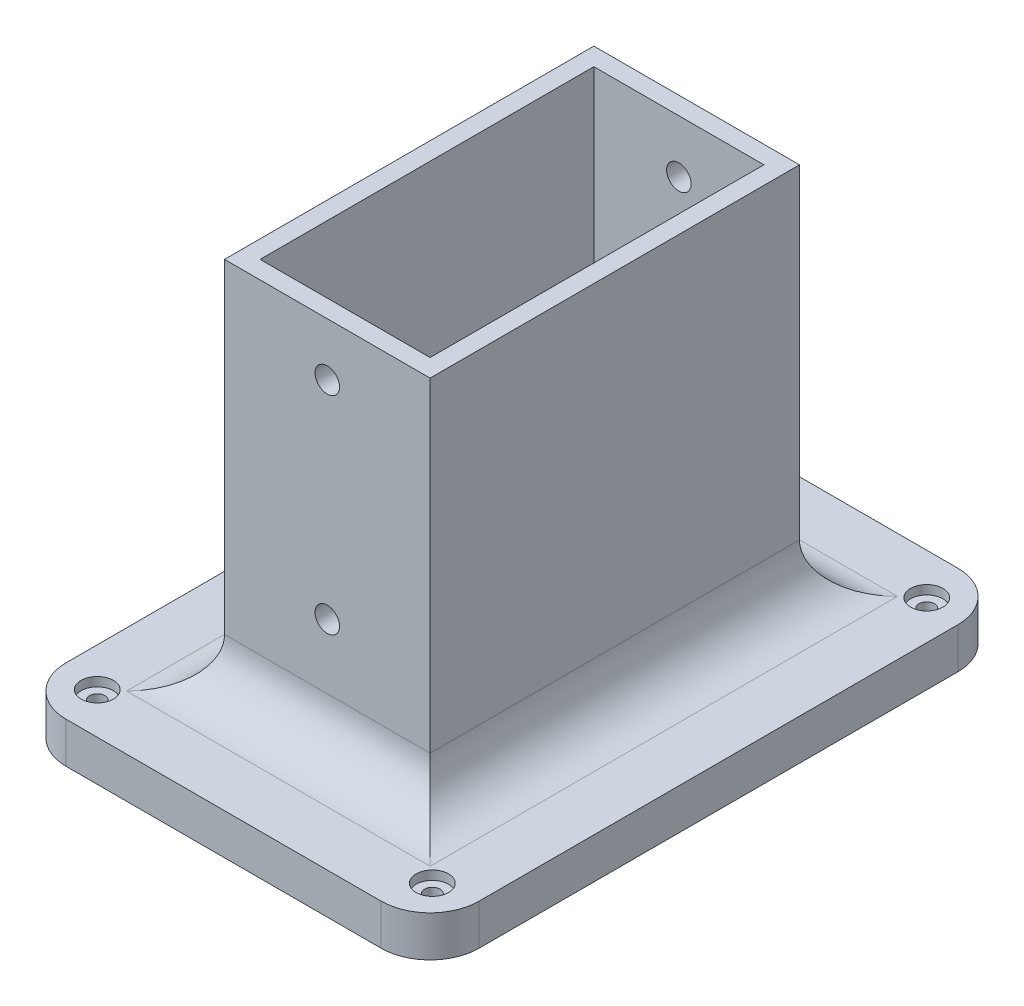
ISO-10303-21;
HEADER;
FILE_DESCRIPTION(('STEP AP214'),'2;1');
FILE_NAME('part.step','',(''),(''),'','','');
FILE_SCHEMA(('AUTOMOTIVE_DESIGN { 1 0 10303 214 1 1 1 1 }'));
ENDSEC;
DATA;
#1=APPLICATION_CONTEXT('core data for automotive mechanical design processes');
#2=APPLICATION_PROTOCOL_DEFINITION('international standard','automotive_design',2000,#1);
#3=PRODUCT_CONTEXT('',#1,'mechanical');
#4=PRODUCT('Part','Part','',(#3));
#5=PRODUCT_RELATED_PRODUCT_CATEGORY('part','',(#4));
#6=PRODUCT_DEFINITION_FORMATION('','',#4);
#7=PRODUCT_DEFINITION_CONTEXT('part definition',#1,'design');
#8=PRODUCT_DEFINITION('design','',#6,#7);
#9=PRODUCT_DEFINITION_SHAPE('','',#8);
#10=(LENGTH_UNIT() NAMED_UNIT(*) SI_UNIT(.MILLI.,.METRE.));
#11=(NAMED_UNIT(*) PLANE_ANGLE_UNIT() SI_UNIT($,.RADIAN.));
#12=(NAMED_UNIT(*) SI_UNIT($,.STERADIAN.) SOLID_ANGLE_UNIT());
#13=UNCERTAINTY_MEASURE_WITH_UNIT(LENGTH_MEASURE(1.E-05),#10,'distance_accuracy_value','');
#14=(GEOMETRIC_REPRESENTATION_CONTEXT(3) GLOBAL_UNCERTAINTY_ASSIGNED_CONTEXT((#13)) GLOBAL_UNIT_ASSIGNED_CONTEXT((#10,
#11,#12)) REPRESENTATION_CONTEXT('',''));
#15=CARTESIAN_POINT('',(0.,0.,0.));
#16=DIRECTION('',(0.,0.,1.));
#17=DIRECTION('',(1.,0.,0.));
#18=AXIS2_PLACEMENT_3D('',#15,#16,#17);
#19=CARTESIAN_POINT('',(25.193,101.6,45.259));
#20=DIRECTION('',(-1.,0.,0.));
#21=DIRECTION('',(0.,0.,1.));
#22=AXIS2_PLACEMENT_3D('',#19,#20,#21);
#23=PLANE('',#22);
#24=DIRECTION('',(0.,-1.,0.));
#25=VECTOR('',#24,1.);
#26=CARTESIAN_POINT('',(25.193,101.6,45.259));
#27=LINE('',#26,#25);
#28=CARTESIAN_POINT('',(25.193,101.6,45.259));
#29=VERTEX_POINT('',#28);
#30=CARTESIAN_POINT('',(25.193,22.,45.259));
#31=VERTEX_POINT('',#30);
#32=EDGE_CURVE('E359',#29,#31,#27,.T.);
#33=ORIENTED_EDGE('',*,*,#32,.T.);
#34=DIRECTION('',(0.,0.,1.));
#35=VECTOR('',#34,1.);
#36=CARTESIAN_POINT('',(25.193,22.,-45.259));
#37=LINE('',#36,#35);
#38=CARTESIAN_POINT('',(25.193,22.,-45.259));
#39=VERTEX_POINT('',#38);
#40=EDGE_CURVE('E388',#31,#39,#37,.F.);
#41=ORIENTED_EDGE('',*,*,#40,.T.);
#42=DIRECTION('',(0.,-1.,0.));
#43=VECTOR('',#42,1.);
#44=CARTESIAN_POINT('',(25.193,101.6,-45.259));
#45=LINE('',#44,#43);
#46=CARTESIAN_POINT('',(25.193,101.6,-45.259));
#47=VERTEX_POINT('',#46);
#48=EDGE_CURVE('E371',#47,#39,#45,.T.);
#49=ORIENTED_EDGE('',*,*,#48,.F.);
#50=DIRECTION('',(0.,0.,-1.));
#51=VECTOR('',#50,1.);
#52=CARTESIAN_POINT('',(25.193,101.6,45.259));
#53=LINE('',#52,#51);
#54=EDGE_CURVE('E331',#29,#47,#53,.T.);
#55=ORIENTED_EDGE('',*,*,#54,.F.);
#56=EDGE_LOOP('',(#33,#41,#49,#55));
#57=FACE_BOUND('',#56,.T.);
#58=ADVANCED_FACE('F45',(#57),#23,.F.);
#59=CARTESIAN_POINT('',(-25.193,101.6,-45.259));
#60=DIRECTION('',(0.,0.,1.));
#61=DIRECTION('',(1.,0.,0.));
#62=AXIS2_PLACEMENT_3D('',#59,#60,#61);
#63=PLANE('',#62);
#64=CARTESIAN_POINT('',(0.,88.6087279060162,-45.259));
#65=DIRECTION('',(0.,0.,1.));
#66=DIRECTION('',(1.,0.,0.));
#67=AXIS2_PLACEMENT_3D('',#64,#65,#66);
#68=CIRCLE('',#67,3.);
#69=CARTESIAN_POINT('',(3.,88.6087279060162,-45.259));
#70=VERTEX_POINT('',#69);
#71=EDGE_CURVE('E230',#70,#70,#68,.T.);
#72=ORIENTED_EDGE('',*,*,#71,.T.);
#73=EDGE_LOOP('',(#72));
#74=FACE_BOUND('',#73,.T.);
#75=CARTESIAN_POINT('',(0.,37.8087279060162,-45.259));
#76=DIRECTION('',(0.,0.,1.));
#77=DIRECTION('',(1.,0.,0.));
#78=AXIS2_PLACEMENT_3D('',#75,#76,#77);
#79=CIRCLE('',#78,3.);
#80=CARTESIAN_POINT('',(3.,37.8087279060162,-45.259));
#81=VERTEX_POINT('',#80);
#82=EDGE_CURVE('E223',#81,#81,#79,.T.);
#83=ORIENTED_EDGE('',*,*,#82,.T.);
#84=EDGE_LOOP('',(#83));
#85=FACE_BOUND('',#84,.T.);
#86=ORIENTED_EDGE('',*,*,#48,.T.);
#87=DIRECTION('',(1.,0.,0.));
#88=VECTOR('',#87,1.);
#89=CARTESIAN_POINT('',(-25.193,22.,-45.259));
#90=LINE('',#89,#88);
#91=CARTESIAN_POINT('',(-25.193,22.,-45.259));
#92=VERTEX_POINT('',#91);
#93=EDGE_CURVE('E392',#39,#92,#90,.F.);
#94=ORIENTED_EDGE('',*,*,#93,.T.);
#95=DIRECTION('',(0.,-1.,0.));
#96=VECTOR('',#95,1.);
#97=CARTESIAN_POINT('',(-25.193,101.6,-45.259));
#98=LINE('',#97,#96);
#99=CARTESIAN_POINT('',(-25.193,101.6,-45.259));
#100=VERTEX_POINT('',#99);
#101=EDGE_CURVE('E367',#100,#92,#98,.T.);
#102=ORIENTED_EDGE('',*,*,#101,.F.);
#103=DIRECTION('',(-1.,0.,0.));
#104=VECTOR('',#103,1.);
#105=CARTESIAN_POINT('',(-25.193,101.6,-45.259));
#106=LINE('',#105,#104);
#107=EDGE_CURVE('E350',#47,#100,#106,.T.);
#108=ORIENTED_EDGE('',*,*,#107,.F.);
#109=EDGE_LOOP('',(#86,#94,#102,#108));
#110=FACE_BOUND('',#109,.T.);
#111=ADVANCED_FACE('F501',(#74,#85,#110),#63,.F.);
#112=CARTESIAN_POINT('',(-25.193,101.6,45.259));
#113=DIRECTION('',(1.,0.,0.));
#114=DIRECTION('',(0.,0.,-1.));
#115=AXIS2_PLACEMENT_3D('',#112,#113,#114);
#116=PLANE('',#115);
#117=ORIENTED_EDGE('',*,*,#101,.T.);
#118=DIRECTION('',(0.,0.,-1.));
#119=VECTOR('',#118,1.);
#120=CARTESIAN_POINT('',(-25.193,22.,45.259));
#121=LINE('',#120,#119);
#122=CARTESIAN_POINT('',(-25.193,22.,45.259));
#123=VERTEX_POINT('',#122);
#124=EDGE_CURVE('E398',#92,#123,#121,.F.);
#125=ORIENTED_EDGE('',*,*,#124,.T.);
#126=DIRECTION('',(0.,-1.,0.));
#127=VECTOR('',#126,1.);
#128=CARTESIAN_POINT('',(-25.193,101.6,45.259));
#129=LINE('',#128,#127);
#130=CARTESIAN_POINT('',(-25.193,101.6,45.259));
#131=VERTEX_POINT('',#130);
#132=EDGE_CURVE('E363',#131,#123,#129,.T.);
#133=ORIENTED_EDGE('',*,*,#132,.F.);
#134=DIRECTION('',(0.,0.,1.));
#135=VECTOR('',#134,1.);
#136=CARTESIAN_POINT('',(-25.193,101.6,45.259));
#137=LINE('',#136,#135);
#138=EDGE_CURVE('E353',#100,#131,#137,.T.);
#139=ORIENTED_EDGE('',*,*,#138,.F.);
#140=EDGE_LOOP('',(#117,#125,#133,#139));
#141=FACE_BOUND('',#140,.T.);
#142=ADVANCED_FACE('F508',(#141),#116,.F.);
#143=CARTESIAN_POINT('',(-25.193,101.6,45.259));
#144=DIRECTION('',(0.,0.,-1.));
#145=DIRECTION('',(-1.,0.,0.));
#146=AXIS2_PLACEMENT_3D('',#143,#144,#145);
#147=PLANE('',#146);
#148=CARTESIAN_POINT('',(0.,88.6087279060162,45.259));
#149=DIRECTION('',(0.,0.,1.));
#150=DIRECTION('',(1.,0.,0.));
#151=AXIS2_PLACEMENT_3D('',#148,#149,#150);
#152=CIRCLE('',#151,3.);
#153=CARTESIAN_POINT('',(3.,88.6087279060162,45.259));
#154=VERTEX_POINT('',#153);
#155=EDGE_CURVE('E219',#154,#154,#152,.T.);
#156=ORIENTED_EDGE('',*,*,#155,.F.);
#157=EDGE_LOOP('',(#156));
#158=FACE_BOUND('',#157,.T.);
#159=CARTESIAN_POINT('',(0.,37.8087279060162,45.259));
#160=DIRECTION('',(0.,0.,1.));
#161=DIRECTION('',(1.,0.,0.));
#162=AXIS2_PLACEMENT_3D('',#159,#160,#161);
#163=CIRCLE('',#162,3.);
#164=CARTESIAN_POINT('',(3.,37.8087279060162,45.259));
#165=VERTEX_POINT('',#164);
#166=EDGE_CURVE('E218',#165,#165,#163,.T.);
#167=ORIENTED_EDGE('',*,*,#166,.F.);
#168=EDGE_LOOP('',(#167));
#169=FACE_BOUND('',#168,.T.);
#170=ORIENTED_EDGE('',*,*,#132,.T.);
#171=DIRECTION('',(-1.,0.,0.));
#172=VECTOR('',#171,1.);
#173=CARTESIAN_POINT('',(25.193,22.,45.259));
#174=LINE('',#173,#172);
#175=EDGE_CURVE('E395',#123,#31,#174,.F.);
#176=ORIENTED_EDGE('',*,*,#175,.T.);
#177=ORIENTED_EDGE('',*,*,#32,.F.);
#178=DIRECTION('',(1.,0.,0.));
#179=VECTOR('',#178,1.);
#180=CARTESIAN_POINT('',(-25.193,101.6,45.259));
#181=LINE('',#180,#179);
#182=EDGE_CURVE('E356',#131,#29,#181,.T.);
#183=ORIENTED_EDGE('',*,*,#182,.F.);
#184=EDGE_LOOP('',(#170,#176,#177,#183));
#185=FACE_BOUND('',#184,.T.);
#186=ADVANCED_FACE('F589',(#158,#169,#185),#147,.F.);
#187=CARTESIAN_POINT('',(0.,101.6,0.));
#188=DIRECTION('',(0.,-1.,0.));
#189=DIRECTION('',(0.,0.,-1.));
#190=AXIS2_PLACEMENT_3D('',#187,#188,#189);
#191=PLANE('',#190);
#192=DIRECTION('',(0.,0.,-1.));
#193=VECTOR('',#192,1.);
#194=CARTESIAN_POINT('',(-20.828,101.6,0.));
#195=LINE('',#194,#193);
#196=CARTESIAN_POINT('',(-20.828,101.6,40.894));
#197=VERTEX_POINT('',#196);
#198=CARTESIAN_POINT('',(-20.828,101.6,-40.894));
#199=VERTEX_POINT('',#198);
#200=EDGE_CURVE('E11',#197,#199,#195,.T.);
#201=ORIENTED_EDGE('',*,*,#200,.T.);
#202=DIRECTION('',(1.,0.,0.));
#203=VECTOR('',#202,1.);
#204=CARTESIAN_POINT('',(0.,101.6,-40.894));
#205=LINE('',#204,#203);
#206=CARTESIAN_POINT('',(20.828,101.6,-40.894));
#207=VERTEX_POINT('',#206);
#208=EDGE_CURVE('E206',#199,#207,#205,.T.);
#209=ORIENTED_EDGE('',*,*,#208,.T.);
#210=DIRECTION('',(0.,0.,1.));
#211=VECTOR('',#210,1.);
#212=CARTESIAN_POINT('',(20.828,101.6,0.));
#213=LINE('',#212,#211);
#214=CARTESIAN_POINT('',(20.828,101.6,40.894));
#215=VERTEX_POINT('',#214);
#216=EDGE_CURVE('E54',#207,#215,#213,.T.);
#217=ORIENTED_EDGE('',*,*,#216,.T.);
#218=DIRECTION('',(-1.,0.,0.));
#219=VECTOR('',#218,1.);
#220=CARTESIAN_POINT('',(0.,101.6,40.894));
#221=LINE('',#220,#219);
#222=EDGE_CURVE('E214',#215,#197,#221,.T.);
#223=ORIENTED_EDGE('',*,*,#222,.T.);
#224=EDGE_LOOP('',(#201,#209,#217,#223));
#225=FACE_BOUND('',#224,.T.);
#226=ORIENTED_EDGE('',*,*,#54,.T.);
#227=ORIENTED_EDGE('',*,*,#107,.T.);
#228=ORIENTED_EDGE('',*,*,#138,.T.);
#229=ORIENTED_EDGE('',*,*,#182,.T.);
#230=EDGE_LOOP('',(#226,#227,#228,#229));
#231=FACE_BOUND('',#230,.T.);
#232=ADVANCED_FACE('F471',(#225,#231),#191,.F.);
#233=CARTESIAN_POINT('',(0.,10.,0.));
#234=DIRECTION('',(0.,-1.,0.));
#235=DIRECTION('',(0.,0.,-1.));
#236=AXIS2_PLACEMENT_3D('',#233,#234,#235);
#237=PLANE('',#236);
#238=CARTESIAN_POINT('',(0.,10.,0.));
#239=DIRECTION('',(0.,1.,0.));
#240=DIRECTION('',(0.,0.,1.));
#241=AXIS2_PLACEMENT_3D('',#238,#239,#240);
#242=CIRCLE('',#241,3.96875);
#243=CARTESIAN_POINT('',(0.,10.,3.96875));
#244=VERTEX_POINT('',#243);
#245=EDGE_CURVE('E234',#244,#244,#242,.T.);
#246=ORIENTED_EDGE('',*,*,#245,.F.);
#247=EDGE_LOOP('',(#246));
#248=FACE_BOUND('',#247,.T.);
#249=DIRECTION('',(0.,0.,-1.));
#250=VECTOR('',#249,1.);
#251=CARTESIAN_POINT('',(20.828,9.99999999999999,0.));
#252=LINE('',#251,#250);
#253=CARTESIAN_POINT('',(20.828,9.99999999999999,40.894));
#254=VERTEX_POINT('',#253);
#255=CARTESIAN_POINT('',(20.828,9.99999999999999,-40.894));
#256=VERTEX_POINT('',#255);
#257=EDGE_CURVE('E188',#254,#256,#252,.T.);
#258=ORIENTED_EDGE('',*,*,#257,.T.);
#259=DIRECTION('',(-1.,0.,0.));
#260=VECTOR('',#259,1.);
#261=CARTESIAN_POINT('',(0.,9.99999999999999,-40.894));
#262=LINE('',#261,#260);
#263=CARTESIAN_POINT('',(-20.828,9.99999999999999,-40.894));
#264=VERTEX_POINT('',#263);
#265=EDGE_CURVE('E174',#256,#264,#262,.T.);
#266=ORIENTED_EDGE('',*,*,#265,.T.);
#267=DIRECTION('',(0.,0.,1.));
#268=VECTOR('',#267,1.);
#269=CARTESIAN_POINT('',(-20.828,9.99999999999999,0.));
#270=LINE('',#269,#268);
#271=CARTESIAN_POINT('',(-20.828,9.99999999999999,40.894));
#272=VERTEX_POINT('',#271);
#273=EDGE_CURVE('E477',#264,#272,#270,.T.);
#274=ORIENTED_EDGE('',*,*,#273,.T.);
#275=DIRECTION('',(1.,0.,0.));
#276=VECTOR('',#275,1.);
#277=CARTESIAN_POINT('',(0.,9.99999999999999,40.894));
#278=LINE('',#277,#276);
#279=EDGE_CURVE('E190',#272,#254,#278,.T.);
#280=ORIENTED_EDGE('',*,*,#279,.T.);
#281=EDGE_LOOP('',(#258,#266,#274,#280));
#282=FACE_BOUND('',#281,.T.);
#283=ADVANCED_FACE('F189',(#248,#282),#237,.F.);
#284=CARTESIAN_POINT('',(41.060456563022,10.,-60.5762500353286));
#285=DIRECTION('',(0.,1.,0.));
#286=DIRECTION('',(0.,0.,1.));
#287=AXIS2_PLACEMENT_3D('',#284,#285,#286);
#288=CIRCLE('',#287,3.96874999999999);
#289=CARTESIAN_POINT('',(41.060456563022,10.,-56.6075000353286));
#290=VERTEX_POINT('',#289);
#291=EDGE_CURVE('E250',#290,#290,#288,.T.);
#292=ORIENTED_EDGE('',*,*,#291,.F.);
#293=EDGE_LOOP('',(#292));
#294=FACE_BOUND('',#293,.T.);
#295=CARTESIAN_POINT('',(-41.060456563022,10.,60.5762500353286));
#296=DIRECTION('',(0.,1.,0.));
#297=DIRECTION('',(0.,0.,1.));
#298=AXIS2_PLACEMENT_3D('',#295,#296,#297);
#299=CIRCLE('',#298,3.96874999999999);
#300=CARTESIAN_POINT('',(-41.060456563022,10.,64.5450000353286));
#301=VERTEX_POINT('',#300);
#302=EDGE_CURVE('E266',#301,#301,#299,.T.);
#303=ORIENTED_EDGE('',*,*,#302,.F.);
#304=EDGE_LOOP('',(#303));
#305=FACE_BOUND('',#304,.T.);
#306=CARTESIAN_POINT('',(-41.060456563022,10.,-60.5762500353286));
#307=DIRECTION('',(0.,1.,0.));
#308=DIRECTION('',(0.,0.,1.));
#309=AXIS2_PLACEMENT_3D('',#306,#307,#308);
#310=CIRCLE('',#309,3.96874999999999);
#311=CARTESIAN_POINT('',(-41.060456563022,10.,-56.6075000353286));
#312=VERTEX_POINT('',#311);
#313=EDGE_CURVE('E282',#312,#312,#310,.T.);
#314=ORIENTED_EDGE('',*,*,#313,.F.);
#315=EDGE_LOOP('',(#314));
#316=FACE_BOUND('',#315,.T.);
#317=CARTESIAN_POINT('',(41.060456563022,10.,60.5762500353286));
#318=DIRECTION('',(0.,1.,0.));
#319=DIRECTION('',(0.,0.,1.));
#320=AXIS2_PLACEMENT_3D('',#317,#318,#319);
#321=CIRCLE('',#320,3.96874999999999);
#322=CARTESIAN_POINT('',(41.060456563022,10.,64.5450000353286));
#323=VERTEX_POINT('',#322);
#324=EDGE_CURVE('E298',#323,#323,#321,.T.);
#325=ORIENTED_EDGE('',*,*,#324,.F.);
#326=EDGE_LOOP('',(#325));
#327=FACE_BOUND('',#326,.T.);
#328=DIRECTION('',(1.,0.,0.));
#329=VECTOR('',#328,1.);
#330=CARTESIAN_POINT('',(25.193,10.,-57.259));
#331=LINE('',#330,#329);
#332=CARTESIAN_POINT('',(-37.193,10.,-57.259));
#333=VERTEX_POINT('',#332);
#334=CARTESIAN_POINT('',(37.193,10.,-57.259));
#335=VERTEX_POINT('',#334);
#336=EDGE_CURVE('E381',#333,#335,#331,.T.);
#337=ORIENTED_EDGE('',*,*,#336,.T.);
#338=DIRECTION('',(0.,0.,1.));
#339=VECTOR('',#338,1.);
#340=CARTESIAN_POINT('',(37.193,10.,45.259));
#341=LINE('',#340,#339);
#342=CARTESIAN_POINT('',(37.193,10.,57.259));
#343=VERTEX_POINT('',#342);
#344=EDGE_CURVE('E384',#335,#343,#341,.T.);
#345=ORIENTED_EDGE('',*,*,#344,.T.);
#346=DIRECTION('',(-1.,0.,0.));
#347=VECTOR('',#346,1.);
#348=CARTESIAN_POINT('',(-25.193,10.,57.259));
#349=LINE('',#348,#347);
#350=CARTESIAN_POINT('',(-37.193,10.,57.259));
#351=VERTEX_POINT('',#350);
#352=EDGE_CURVE('E378',#343,#351,#349,.T.);
#353=ORIENTED_EDGE('',*,*,#352,.T.);
#354=DIRECTION('',(0.,0.,-1.));
#355=VECTOR('',#354,1.);
#356=CARTESIAN_POINT('',(-37.193,10.,-45.259));
#357=LINE('',#356,#355);
#358=EDGE_CURVE('E375',#351,#333,#357,.T.);
#359=ORIENTED_EDGE('',*,*,#358,.T.);
#360=EDGE_LOOP('',(#337,#345,#353,#359));
#361=FACE_BOUND('',#360,.T.);
#362=DIRECTION('',(0.,0.,-1.));
#363=VECTOR('',#362,1.);
#364=CARTESIAN_POINT('',(50.593,10.,70.659));
#365=LINE('',#364,#363);
#366=CARTESIAN_POINT('',(50.593,10.,58.659));
#367=VERTEX_POINT('',#366);
#368=CARTESIAN_POINT('',(50.593,10.,-58.659));
#369=VERTEX_POINT('',#368);
#370=EDGE_CURVE('E315',#367,#369,#365,.T.);
#371=ORIENTED_EDGE('',*,*,#370,.T.);
#372=CARTESIAN_POINT('',(38.593,10.,-58.659));
#373=DIRECTION('',(0.,-1.,0.));
#374=DIRECTION('',(0.,0.,-1.));
#375=AXIS2_PLACEMENT_3D('',#372,#373,#374);
#376=CIRCLE('',#375,12.);
#377=CARTESIAN_POINT('',(38.593,10.,-70.659));
#378=VERTEX_POINT('',#377);
#379=EDGE_CURVE('E448',#369,#378,#376,.F.);
#380=ORIENTED_EDGE('',*,*,#379,.T.);
#381=DIRECTION('',(-1.,0.,0.));
#382=VECTOR('',#381,1.);
#383=CARTESIAN_POINT('',(-50.593,10.,-70.659));
#384=LINE('',#383,#382);
#385=CARTESIAN_POINT('',(-38.593,10.,-70.659));
#386=VERTEX_POINT('',#385);
#387=EDGE_CURVE('E319',#378,#386,#384,.T.);
#388=ORIENTED_EDGE('',*,*,#387,.T.);
#389=CARTESIAN_POINT('',(-38.593,10.,-58.659));
#390=DIRECTION('',(0.,-1.,0.));
#391=DIRECTION('',(0.,0.,-1.));
#392=AXIS2_PLACEMENT_3D('',#389,#390,#391);
#393=CIRCLE('',#392,12.);
#394=CARTESIAN_POINT('',(-50.593,10.,-58.659));
#395=VERTEX_POINT('',#394);
#396=EDGE_CURVE('E439',#386,#395,#393,.F.);
#397=ORIENTED_EDGE('',*,*,#396,.T.);
#398=DIRECTION('',(0.,0.,1.));
#399=VECTOR('',#398,1.);
#400=CARTESIAN_POINT('',(-50.593,10.,70.659));
#401=LINE('',#400,#399);
#402=CARTESIAN_POINT('',(-50.593,10.,58.659));
#403=VERTEX_POINT('',#402);
#404=EDGE_CURVE('E324',#395,#403,#401,.T.);
#405=ORIENTED_EDGE('',*,*,#404,.T.);
#406=CARTESIAN_POINT('',(-38.593,10.,58.659));
#407=DIRECTION('',(0.,-1.,0.));
#408=DIRECTION('',(0.,0.,-1.));
#409=AXIS2_PLACEMENT_3D('',#406,#407,#408);
#410=CIRCLE('',#409,12.);
#411=CARTESIAN_POINT('',(-38.593,10.,70.659));
#412=VERTEX_POINT('',#411);
#413=EDGE_CURVE('E442',#403,#412,#410,.F.);
#414=ORIENTED_EDGE('',*,*,#413,.T.);
#415=DIRECTION('',(1.,0.,0.));
#416=VECTOR('',#415,1.);
#417=CARTESIAN_POINT('',(-50.593,10.,70.659));
#418=LINE('',#417,#416);
#419=CARTESIAN_POINT('',(38.593,10.,70.659));
#420=VERTEX_POINT('',#419);
#421=EDGE_CURVE('E328',#412,#420,#418,.T.);
#422=ORIENTED_EDGE('',*,*,#421,.T.);
#423=CARTESIAN_POINT('',(38.593,10.,58.659));
#424=DIRECTION('',(0.,-1.,0.));
#425=DIRECTION('',(0.,0.,-1.));
#426=AXIS2_PLACEMENT_3D('',#423,#424,#425);
#427=CIRCLE('',#426,12.);
#428=EDGE_CURVE('E445',#420,#367,#427,.F.);
#429=ORIENTED_EDGE('',*,*,#428,.T.);
#430=EDGE_LOOP('',(#371,#380,#388,#397,#405,#414,#422,#429));
#431=FACE_BOUND('',#430,.T.);
#432=ADVANCED_FACE('F551',(#294,#305,#316,#327,#361,#431),#237,.F.);
#433=CARTESIAN_POINT('',(50.593,10.,70.659));
#434=DIRECTION('',(-1.,0.,0.));
#435=DIRECTION('',(0.,0.,1.));
#436=AXIS2_PLACEMENT_3D('',#433,#434,#435);
#437=PLANE('',#436);
#438=DIRECTION('',(0.,0.,-1.));
#439=VECTOR('',#438,1.);
#440=CARTESIAN_POINT('',(50.593,0.,70.659));
#441=LINE('',#440,#439);
#442=CARTESIAN_POINT('',(50.593,0.,58.659));
#443=VERTEX_POINT('',#442);
#444=CARTESIAN_POINT('',(50.593,0.,-58.659));
#445=VERTEX_POINT('',#444);
#446=EDGE_CURVE('E332',#443,#445,#441,.T.);
#447=ORIENTED_EDGE('',*,*,#446,.T.);
#448=DIRECTION('',(0.,-1.,0.));
#449=VECTOR('',#448,1.);
#450=CARTESIAN_POINT('',(50.593,10.,-58.659));
#451=LINE('',#450,#449);
#452=EDGE_CURVE('E436',#445,#369,#451,.F.);
#453=ORIENTED_EDGE('',*,*,#452,.T.);
#454=ORIENTED_EDGE('',*,*,#370,.F.);
#455=DIRECTION('',(0.,-1.,0.));
#456=VECTOR('',#455,1.);
#457=CARTESIAN_POINT('',(50.593,10.,58.659));
#458=LINE('',#457,#456);
#459=EDGE_CURVE('E432',#367,#443,#458,.T.);
#460=ORIENTED_EDGE('',*,*,#459,.T.);
#461=EDGE_LOOP('',(#447,#453,#454,#460));
#462=FACE_BOUND('',#461,.T.);
#463=ADVANCED_FACE('F563',(#462),#437,.F.);
#464=CARTESIAN_POINT('',(-50.593,10.,-70.659));
#465=DIRECTION('',(0.,0.,1.));
#466=DIRECTION('',(1.,0.,0.));
#467=AXIS2_PLACEMENT_3D('',#464,#465,#466);
#468=PLANE('',#467);
#469=ORIENTED_EDGE('',*,*,#387,.F.);
#470=DIRECTION('',(0.,-1.,0.));
#471=VECTOR('',#470,1.);
#472=CARTESIAN_POINT('',(38.593,10.,-70.659));
#473=LINE('',#472,#471);
#474=CARTESIAN_POINT('',(38.593,0.,-70.659));
#475=VERTEX_POINT('',#474);
#476=EDGE_CURVE('E416',#378,#475,#473,.T.);
#477=ORIENTED_EDGE('',*,*,#476,.T.);
#478=DIRECTION('',(-1.,0.,0.));
#479=VECTOR('',#478,1.);
#480=CARTESIAN_POINT('',(-50.593,0.,-70.659));
#481=LINE('',#480,#479);
#482=CARTESIAN_POINT('',(-38.593,0.,-70.659));
#483=VERTEX_POINT('',#482);
#484=EDGE_CURVE('E336',#475,#483,#481,.T.);
#485=ORIENTED_EDGE('',*,*,#484,.T.);
#486=DIRECTION('',(0.,-1.,0.));
#487=VECTOR('',#486,1.);
#488=CARTESIAN_POINT('',(-38.593,10.,-70.659));
#489=LINE('',#488,#487);
#490=EDGE_CURVE('E401',#483,#386,#489,.F.);
#491=ORIENTED_EDGE('',*,*,#490,.T.);
#492=EDGE_LOOP('',(#469,#477,#485,#491));
#493=FACE_BOUND('',#492,.T.);
#494=ADVANCED_FACE('F569',(#493),#468,.F.);
#495=CARTESIAN_POINT('',(-50.593,10.,70.659));
#496=DIRECTION('',(1.,0.,0.));
#497=DIRECTION('',(0.,0.,-1.));
#498=AXIS2_PLACEMENT_3D('',#495,#496,#497);
#499=PLANE('',#498);
#500=DIRECTION('',(0.,0.,1.));
#501=VECTOR('',#500,1.);
#502=CARTESIAN_POINT('',(-50.593,0.,70.659));
#503=LINE('',#502,#501);
#504=CARTESIAN_POINT('',(-50.593,0.,-58.659));
#505=VERTEX_POINT('',#504);
#506=CARTESIAN_POINT('',(-50.593,0.,58.659));
#507=VERTEX_POINT('',#506);
#508=EDGE_CURVE('E341',#505,#507,#503,.T.);
#509=ORIENTED_EDGE('',*,*,#508,.T.);
#510=DIRECTION('',(0.,-1.,0.));
#511=VECTOR('',#510,1.);
#512=CARTESIAN_POINT('',(-50.593,10.,58.659));
#513=LINE('',#512,#511);
#514=EDGE_CURVE('E461',#507,#403,#513,.F.);
#515=ORIENTED_EDGE('',*,*,#514,.T.);
#516=ORIENTED_EDGE('',*,*,#404,.F.);
#517=DIRECTION('',(0.,-1.,0.));
#518=VECTOR('',#517,1.);
#519=CARTESIAN_POINT('',(-50.593,10.,-58.659));
#520=LINE('',#519,#518);
#521=EDGE_CURVE('E457',#395,#505,#520,.T.);
#522=ORIENTED_EDGE('',*,*,#521,.T.);
#523=EDGE_LOOP('',(#509,#515,#516,#522));
#524=FACE_BOUND('',#523,.T.);
#525=ADVANCED_FACE('F574',(#524),#499,.F.);
#526=CARTESIAN_POINT('',(-50.593,10.,70.659));
#527=DIRECTION('',(0.,0.,-1.));
#528=DIRECTION('',(-1.,0.,0.));
#529=AXIS2_PLACEMENT_3D('',#526,#527,#528);
#530=PLANE('',#529);
#531=DIRECTION('',(1.,0.,0.));
#532=VECTOR('',#531,1.);
#533=CARTESIAN_POINT('',(-50.593,0.,70.659));
#534=LINE('',#533,#532);
#535=CARTESIAN_POINT('',(-38.593,0.,70.659));
#536=VERTEX_POINT('',#535);
#537=CARTESIAN_POINT('',(38.593,0.,70.659));
#538=VERTEX_POINT('',#537);
#539=EDGE_CURVE('E320',#536,#538,#534,.T.);
#540=ORIENTED_EDGE('',*,*,#539,.T.);
#541=DIRECTION('',(0.,-1.,0.));
#542=VECTOR('',#541,1.);
#543=CARTESIAN_POINT('',(38.593,10.,70.659));
#544=LINE('',#543,#542);
#545=EDGE_CURVE('E69',#538,#420,#544,.F.);
#546=ORIENTED_EDGE('',*,*,#545,.T.);
#547=ORIENTED_EDGE('',*,*,#421,.F.);
#548=DIRECTION('',(0.,-1.,0.));
#549=VECTOR('',#548,1.);
#550=CARTESIAN_POINT('',(-38.593,10.,70.659));
#551=LINE('',#550,#549);
#552=EDGE_CURVE('E451',#412,#536,#551,.T.);
#553=ORIENTED_EDGE('',*,*,#552,.T.);
#554=EDGE_LOOP('',(#540,#546,#547,#553));
#555=FACE_BOUND('',#554,.T.);
#556=ADVANCED_FACE('F554',(#555),#530,.F.);
#557=CARTESIAN_POINT('',(0.,0.,0.));
#558=DIRECTION('',(0.,-1.,0.));
#559=DIRECTION('',(0.,0.,-1.));
#560=AXIS2_PLACEMENT_3D('',#557,#558,#559);
#561=PLANE('',#560);
#562=CARTESIAN_POINT('',(0.,0.,0.));
#563=DIRECTION('',(0.,1.,0.));
#564=DIRECTION('',(0.,0.,1.));
#565=AXIS2_PLACEMENT_3D('',#562,#563,#564);
#566=CIRCLE('',#565,1.89865);
#567=CARTESIAN_POINT('',(0.,0.,1.89865));
#568=VERTEX_POINT('',#567);
#569=EDGE_CURVE('E246',#568,#568,#566,.T.);
#570=ORIENTED_EDGE('',*,*,#569,.T.);
#571=EDGE_LOOP('',(#570));
#572=FACE_BOUND('',#571,.T.);
#573=CARTESIAN_POINT('',(41.060456563022,0.,-60.5762500353286));
#574=DIRECTION('',(0.,1.,0.));
#575=DIRECTION('',(0.,0.,1.));
#576=AXIS2_PLACEMENT_3D('',#573,#574,#575);
#577=CIRCLE('',#576,1.89864999999999);
#578=CARTESIAN_POINT('',(41.060456563022,0.,-58.6776000353286));
#579=VERTEX_POINT('',#578);
#580=EDGE_CURVE('E262',#579,#579,#577,.T.);
#581=ORIENTED_EDGE('',*,*,#580,.T.);
#582=EDGE_LOOP('',(#581));
#583=FACE_BOUND('',#582,.T.);
#584=CARTESIAN_POINT('',(-41.060456563022,0.,60.5762500353286));
#585=DIRECTION('',(0.,1.,0.));
#586=DIRECTION('',(0.,0.,1.));
#587=AXIS2_PLACEMENT_3D('',#584,#585,#586);
#588=CIRCLE('',#587,1.89864999999999);
#589=CARTESIAN_POINT('',(-41.060456563022,0.,62.4749000353286));
#590=VERTEX_POINT('',#589);
#591=EDGE_CURVE('E278',#590,#590,#588,.T.);
#592=ORIENTED_EDGE('',*,*,#591,.T.);
#593=EDGE_LOOP('',(#592));
#594=FACE_BOUND('',#593,.T.);
#595=CARTESIAN_POINT('',(-41.060456563022,0.,-60.5762500353286));
#596=DIRECTION('',(0.,1.,0.));
#597=DIRECTION('',(0.,0.,1.));
#598=AXIS2_PLACEMENT_3D('',#595,#596,#597);
#599=CIRCLE('',#598,1.89864999999999);
#600=CARTESIAN_POINT('',(-41.060456563022,0.,-58.6776000353286));
#601=VERTEX_POINT('',#600);
#602=EDGE_CURVE('E294',#601,#601,#599,.T.);
#603=ORIENTED_EDGE('',*,*,#602,.T.);
#604=EDGE_LOOP('',(#603));
#605=FACE_BOUND('',#604,.T.);
#606=CARTESIAN_POINT('',(41.060456563022,0.,60.5762500353286));
#607=DIRECTION('',(0.,1.,0.));
#608=DIRECTION('',(0.,0.,1.));
#609=AXIS2_PLACEMENT_3D('',#606,#607,#608);
#610=CIRCLE('',#609,1.89864999999999);
#611=CARTESIAN_POINT('',(41.060456563022,0.,62.4749000353286));
#612=VERTEX_POINT('',#611);
#613=EDGE_CURVE('E310',#612,#612,#610,.T.);
#614=ORIENTED_EDGE('',*,*,#613,.T.);
#615=EDGE_LOOP('',(#614));
#616=FACE_BOUND('',#615,.T.);
#617=ORIENTED_EDGE('',*,*,#484,.F.);
#618=CARTESIAN_POINT('',(38.593,0.,-58.659));
#619=DIRECTION('',(0.,-1.,0.));
#620=DIRECTION('',(0.,0.,-1.));
#621=AXIS2_PLACEMENT_3D('',#618,#619,#620);
#622=CIRCLE('',#621,12.);
#623=EDGE_CURVE('E429',#475,#445,#622,.T.);
#624=ORIENTED_EDGE('',*,*,#623,.T.);
#625=ORIENTED_EDGE('',*,*,#446,.F.);
#626=CARTESIAN_POINT('',(38.593,0.,58.659));
#627=DIRECTION('',(0.,-1.,0.));
#628=DIRECTION('',(0.,0.,-1.));
#629=AXIS2_PLACEMENT_3D('',#626,#627,#628);
#630=CIRCLE('',#629,12.);
#631=EDGE_CURVE('E426',#443,#538,#630,.T.);
#632=ORIENTED_EDGE('',*,*,#631,.T.);
#633=ORIENTED_EDGE('',*,*,#539,.F.);
#634=CARTESIAN_POINT('',(-38.593,0.,58.659));
#635=DIRECTION('',(0.,-1.,0.));
#636=DIRECTION('',(0.,0.,-1.));
#637=AXIS2_PLACEMENT_3D('',#634,#635,#636);
#638=CIRCLE('',#637,12.);
#639=EDGE_CURVE('E423',#536,#507,#638,.T.);
#640=ORIENTED_EDGE('',*,*,#639,.T.);
#641=ORIENTED_EDGE('',*,*,#508,.F.);
#642=CARTESIAN_POINT('',(-38.593,0.,-58.659));
#643=DIRECTION('',(0.,-1.,0.));
#644=DIRECTION('',(0.,0.,-1.));
#645=AXIS2_PLACEMENT_3D('',#642,#643,#644);
#646=CIRCLE('',#645,12.);
#647=EDGE_CURVE('E420',#505,#483,#646,.T.);
#648=ORIENTED_EDGE('',*,*,#647,.T.);
#649=EDGE_LOOP('',(#617,#624,#625,#632,#633,#640,#641,#648));
#650=FACE_BOUND('',#649,.T.);
#651=ADVANCED_FACE('F529',(#572,#583,#594,#605,#616,#650),#561,.T.);
#652=CARTESIAN_POINT('',(-37.193,22.,0.));
#653=DIRECTION('',(0.,0.,1.));
#654=DIRECTION('',(1.,0.,0.));
#655=AXIS2_PLACEMENT_3D('',#652,#653,#654);
#656=CYLINDRICAL_SURFACE('',#655,12.);
#657=CARTESIAN_POINT('',(-37.193,22.,57.259));
#658=DIRECTION('',(0.707106781186547,0.,0.707106781186547));
#659=DIRECTION('',(-0.707106781186547,0.,0.707106781186547));
#660=AXIS2_PLACEMENT_3D('',#657,#658,#659);
#661=ELLIPSE('',#660,16.9705627484771,12.);
#662=EDGE_CURVE('E407',#123,#351,#661,.F.);
#663=ORIENTED_EDGE('',*,*,#662,.F.);
#664=ORIENTED_EDGE('',*,*,#124,.F.);
#665=CARTESIAN_POINT('',(-37.193,22.,-57.259));
#666=DIRECTION('',(-0.707106781186547,0.,0.707106781186547));
#667=DIRECTION('',(0.707106781186547,0.,0.707106781186547));
#668=AXIS2_PLACEMENT_3D('',#665,#666,#667);
#669=ELLIPSE('',#668,16.9705627484771,12.);
#670=EDGE_CURVE('E337',#333,#92,#669,.T.);
#671=ORIENTED_EDGE('',*,*,#670,.F.);
#672=ORIENTED_EDGE('',*,*,#358,.F.);
#673=EDGE_LOOP('',(#663,#664,#671,#672));
#674=FACE_BOUND('',#673,.T.);
#675=ADVANCED_FACE('F525',(#674),#656,.F.);
#676=CARTESIAN_POINT('',(0.,22.,-57.259));
#677=DIRECTION('',(-1.,0.,0.));
#678=DIRECTION('',(0.,0.,1.));
#679=AXIS2_PLACEMENT_3D('',#676,#677,#678);
#680=CYLINDRICAL_SURFACE('',#679,12.);
#681=ORIENTED_EDGE('',*,*,#670,.T.);
#682=ORIENTED_EDGE('',*,*,#93,.F.);
#683=CARTESIAN_POINT('',(37.193,22.,-57.259));
#684=DIRECTION('',(-0.707106781186547,0.,-0.707106781186547));
#685=DIRECTION('',(-0.707106781186547,0.,0.707106781186547));
#686=AXIS2_PLACEMENT_3D('',#683,#684,#685);
#687=ELLIPSE('',#686,16.9705627484771,12.);
#688=EDGE_CURVE('E404',#335,#39,#687,.T.);
#689=ORIENTED_EDGE('',*,*,#688,.F.);
#690=ORIENTED_EDGE('',*,*,#336,.F.);
#691=EDGE_LOOP('',(#681,#682,#689,#690));
#692=FACE_BOUND('',#691,.T.);
#693=ADVANCED_FACE('F521',(#692),#680,.F.);
#694=CARTESIAN_POINT('',(0.,22.,57.259));
#695=DIRECTION('',(1.,0.,0.));
#696=DIRECTION('',(0.,0.,-1.));
#697=AXIS2_PLACEMENT_3D('',#694,#695,#696);
#698=CYLINDRICAL_SURFACE('',#697,12.);
#699=ORIENTED_EDGE('',*,*,#662,.T.);
#700=ORIENTED_EDGE('',*,*,#352,.F.);
#701=CARTESIAN_POINT('',(37.193,22.,57.259));
#702=DIRECTION('',(0.707106781186547,0.,-0.707106781186547));
#703=DIRECTION('',(0.707106781186547,0.,0.707106781186547));
#704=AXIS2_PLACEMENT_3D('',#701,#702,#703);
#705=ELLIPSE('',#704,16.9705627484771,12.);
#706=EDGE_CURVE('E314',#31,#343,#705,.F.);
#707=ORIENTED_EDGE('',*,*,#706,.F.);
#708=ORIENTED_EDGE('',*,*,#175,.F.);
#709=EDGE_LOOP('',(#699,#700,#707,#708));
#710=FACE_BOUND('',#709,.T.);
#711=ADVANCED_FACE('F517',(#710),#698,.F.);
#712=CARTESIAN_POINT('',(37.193,22.,0.));
#713=DIRECTION('',(0.,0.,-1.));
#714=DIRECTION('',(-1.,0.,0.));
#715=AXIS2_PLACEMENT_3D('',#712,#713,#714);
#716=CYLINDRICAL_SURFACE('',#715,12.);
#717=ORIENTED_EDGE('',*,*,#688,.T.);
#718=ORIENTED_EDGE('',*,*,#40,.F.);
#719=ORIENTED_EDGE('',*,*,#706,.T.);
#720=ORIENTED_EDGE('',*,*,#344,.F.);
#721=EDGE_LOOP('',(#717,#718,#719,#720));
#722=FACE_BOUND('',#721,.T.);
#723=ADVANCED_FACE('F513',(#722),#716,.F.);
#724=CARTESIAN_POINT('',(41.060456563022,10.,60.5762500353286));
#725=DIRECTION('',(0.,1.,0.));
#726=DIRECTION('',(0.,0.,1.));
#727=AXIS2_PLACEMENT_3D('',#724,#725,#726);
#728=CYLINDRICAL_SURFACE('',#727,1.89865000000001);
#729=ORIENTED_EDGE('',*,*,#613,.F.);
#730=EDGE_LOOP('',(#729));
#731=FACE_BOUND('',#730,.T.);
#732=CARTESIAN_POINT('',(41.060456563022,7.7902,60.5762500353286));
#733=DIRECTION('',(0.,1.,0.));
#734=DIRECTION('',(0.,0.,1.));
#735=AXIS2_PLACEMENT_3D('',#732,#733,#734);
#736=CIRCLE('',#735,1.89865000000002);
#737=CARTESIAN_POINT('',(41.060456563022,7.7902,62.4749000353286));
#738=VERTEX_POINT('',#737);
#739=EDGE_CURVE('E306',#738,#738,#736,.T.);
#740=ORIENTED_EDGE('',*,*,#739,.T.);
#741=EDGE_LOOP('',(#740));
#742=FACE_BOUND('',#741,.T.);
#743=ADVANCED_FACE('F516',(#731,#742),#728,.F.);
#744=CARTESIAN_POINT('',(42.959106563022,7.7902,60.5762500353286));
#745=DIRECTION('',(0.,-1.,0.));
#746=DIRECTION('',(0.,0.,-1.));
#747=AXIS2_PLACEMENT_3D('',#744,#745,#746);
#748=PLANE('',#747);
#749=ORIENTED_EDGE('',*,*,#739,.F.);
#750=EDGE_LOOP('',(#749));
#751=FACE_BOUND('',#750,.T.);
#752=CARTESIAN_POINT('',(41.060456563022,7.7902,60.5762500353286));
#753=DIRECTION('',(0.,1.,0.));
#754=DIRECTION('',(0.,0.,1.));
#755=AXIS2_PLACEMENT_3D('',#752,#753,#754);
#756=CIRCLE('',#755,3.96874999999999);
#757=CARTESIAN_POINT('',(41.060456563022,7.7902,64.5450000353286));
#758=VERTEX_POINT('',#757);
#759=EDGE_CURVE('E302',#758,#758,#756,.T.);
#760=ORIENTED_EDGE('',*,*,#759,.T.);
#761=EDGE_LOOP('',(#760));
#762=FACE_BOUND('',#761,.T.);
#763=ADVANCED_FACE('F632',(#751,#762),#748,.F.);
#764=CARTESIAN_POINT('',(41.060456563022,10.,60.5762500353286));
#765=DIRECTION('',(0.,1.,0.));
#766=DIRECTION('',(0.,0.,1.));
#767=AXIS2_PLACEMENT_3D('',#764,#765,#766);
#768=CYLINDRICAL_SURFACE('',#767,3.96874999999999);
#769=ORIENTED_EDGE('',*,*,#759,.F.);
#770=EDGE_LOOP('',(#769));
#771=FACE_BOUND('',#770,.T.);
#772=ORIENTED_EDGE('',*,*,#324,.T.);
#773=EDGE_LOOP('',(#772));
#774=FACE_BOUND('',#773,.T.);
#775=ADVANCED_FACE('F636',(#771,#774),#768,.F.);
#776=CARTESIAN_POINT('',(-41.060456563022,10.,-60.5762500353286));
#777=DIRECTION('',(0.,1.,0.));
#778=DIRECTION('',(0.,0.,1.));
#779=AXIS2_PLACEMENT_3D('',#776,#777,#778);
#780=CYLINDRICAL_SURFACE('',#779,1.89865000000001);
#781=ORIENTED_EDGE('',*,*,#602,.F.);
#782=EDGE_LOOP('',(#781));
#783=FACE_BOUND('',#782,.T.);
#784=CARTESIAN_POINT('',(-41.060456563022,7.7902,-60.5762500353286));
#785=DIRECTION('',(0.,1.,0.));
#786=DIRECTION('',(0.,0.,1.));
#787=AXIS2_PLACEMENT_3D('',#784,#785,#786);
#788=CIRCLE('',#787,1.89865000000002);
#789=CARTESIAN_POINT('',(-41.060456563022,7.7902,-58.6776000353286));
#790=VERTEX_POINT('',#789);
#791=EDGE_CURVE('E290',#790,#790,#788,.T.);
#792=ORIENTED_EDGE('',*,*,#791,.T.);
#793=EDGE_LOOP('',(#792));
#794=FACE_BOUND('',#793,.T.);
#795=ADVANCED_FACE('F640',(#783,#794),#780,.F.);
#796=CARTESIAN_POINT('',(-39.1618065630219,7.7902,-60.5762500353286));
#797=DIRECTION('',(0.,-1.,0.));
#798=DIRECTION('',(0.,0.,-1.));
#799=AXIS2_PLACEMENT_3D('',#796,#797,#798);
#800=PLANE('',#799);
#801=ORIENTED_EDGE('',*,*,#791,.F.);
#802=EDGE_LOOP('',(#801));
#803=FACE_BOUND('',#802,.T.);
#804=CARTESIAN_POINT('',(-41.060456563022,7.7902,-60.5762500353286));
#805=DIRECTION('',(0.,1.,0.));
#806=DIRECTION('',(0.,0.,1.));
#807=AXIS2_PLACEMENT_3D('',#804,#805,#806);
#808=CIRCLE('',#807,3.96874999999999);
#809=CARTESIAN_POINT('',(-41.060456563022,7.7902,-56.6075000353286));
#810=VERTEX_POINT('',#809);
#811=EDGE_CURVE('E286',#810,#810,#808,.T.);
#812=ORIENTED_EDGE('',*,*,#811,.T.);
#813=EDGE_LOOP('',(#812));
#814=FACE_BOUND('',#813,.T.);
#815=ADVANCED_FACE('F644',(#803,#814),#800,.F.);
#816=CARTESIAN_POINT('',(-41.060456563022,10.,-60.5762500353286));
#817=DIRECTION('',(0.,1.,0.));
#818=DIRECTION('',(0.,0.,1.));
#819=AXIS2_PLACEMENT_3D('',#816,#817,#818);
#820=CYLINDRICAL_SURFACE('',#819,3.96874999999999);
#821=ORIENTED_EDGE('',*,*,#811,.F.);
#822=EDGE_LOOP('',(#821));
#823=FACE_BOUND('',#822,.T.);
#824=ORIENTED_EDGE('',*,*,#313,.T.);
#825=EDGE_LOOP('',(#824));
#826=FACE_BOUND('',#825,.T.);
#827=ADVANCED_FACE('F648',(#823,#826),#820,.F.);
#828=CARTESIAN_POINT('',(-41.060456563022,10.,60.5762500353286));
#829=DIRECTION('',(0.,1.,0.));
#830=DIRECTION('',(0.,0.,1.));
#831=AXIS2_PLACEMENT_3D('',#828,#829,#830);
#832=CYLINDRICAL_SURFACE('',#831,1.89865000000001);
#833=ORIENTED_EDGE('',*,*,#591,.F.);
#834=EDGE_LOOP('',(#833));
#835=FACE_BOUND('',#834,.T.);
#836=CARTESIAN_POINT('',(-41.060456563022,7.7902,60.5762500353286));
#837=DIRECTION('',(0.,1.,0.));
#838=DIRECTION('',(0.,0.,1.));
#839=AXIS2_PLACEMENT_3D('',#836,#837,#838);
#840=CIRCLE('',#839,1.89865000000002);
#841=CARTESIAN_POINT('',(-41.060456563022,7.7902,62.4749000353286));
#842=VERTEX_POINT('',#841);
#843=EDGE_CURVE('E274',#842,#842,#840,.T.);
#844=ORIENTED_EDGE('',*,*,#843,.T.);
#845=EDGE_LOOP('',(#844));
#846=FACE_BOUND('',#845,.T.);
#847=ADVANCED_FACE('F652',(#835,#846),#832,.F.);
#848=CARTESIAN_POINT('',(-39.1618065630219,7.7902,60.5762500353286));
#849=DIRECTION('',(0.,-1.,0.));
#850=DIRECTION('',(0.,0.,-1.));
#851=AXIS2_PLACEMENT_3D('',#848,#849,#850);
#852=PLANE('',#851);
#853=ORIENTED_EDGE('',*,*,#843,.F.);
#854=EDGE_LOOP('',(#853));
#855=FACE_BOUND('',#854,.T.);
#856=CARTESIAN_POINT('',(-41.060456563022,7.7902,60.5762500353286));
#857=DIRECTION('',(0.,1.,0.));
#858=DIRECTION('',(0.,0.,1.));
#859=AXIS2_PLACEMENT_3D('',#856,#857,#858);
#860=CIRCLE('',#859,3.96874999999999);
#861=CARTESIAN_POINT('',(-41.060456563022,7.7902,64.5450000353286));
#862=VERTEX_POINT('',#861);
#863=EDGE_CURVE('E270',#862,#862,#860,.T.);
#864=ORIENTED_EDGE('',*,*,#863,.T.);
#865=EDGE_LOOP('',(#864));
#866=FACE_BOUND('',#865,.T.);
#867=ADVANCED_FACE('F656',(#855,#866),#852,.F.);
#868=CARTESIAN_POINT('',(-41.060456563022,10.,60.5762500353286));
#869=DIRECTION('',(0.,1.,0.));
#870=DIRECTION('',(0.,0.,1.));
#871=AXIS2_PLACEMENT_3D('',#868,#869,#870);
#872=CYLINDRICAL_SURFACE('',#871,3.96874999999999);
#873=ORIENTED_EDGE('',*,*,#863,.F.);
#874=EDGE_LOOP('',(#873));
#875=FACE_BOUND('',#874,.T.);
#876=ORIENTED_EDGE('',*,*,#302,.T.);
#877=EDGE_LOOP('',(#876));
#878=FACE_BOUND('',#877,.T.);
#879=ADVANCED_FACE('F660',(#875,#878),#872,.F.);
#880=CARTESIAN_POINT('',(41.060456563022,10.,-60.5762500353286));
#881=DIRECTION('',(0.,1.,0.));
#882=DIRECTION('',(0.,0.,1.));
#883=AXIS2_PLACEMENT_3D('',#880,#881,#882);
#884=CYLINDRICAL_SURFACE('',#883,1.89865000000001);
#885=ORIENTED_EDGE('',*,*,#580,.F.);
#886=EDGE_LOOP('',(#885));
#887=FACE_BOUND('',#886,.T.);
#888=CARTESIAN_POINT('',(41.060456563022,7.7902,-60.5762500353286));
#889=DIRECTION('',(0.,1.,0.));
#890=DIRECTION('',(0.,0.,1.));
#891=AXIS2_PLACEMENT_3D('',#888,#889,#890);
#892=CIRCLE('',#891,1.89865000000002);
#893=CARTESIAN_POINT('',(41.060456563022,7.7902,-58.6776000353286));
#894=VERTEX_POINT('',#893);
#895=EDGE_CURVE('E258',#894,#894,#892,.T.);
#896=ORIENTED_EDGE('',*,*,#895,.T.);
#897=EDGE_LOOP('',(#896));
#898=FACE_BOUND('',#897,.T.);
#899=ADVANCED_FACE('F664',(#887,#898),#884,.F.);
#900=CARTESIAN_POINT('',(42.959106563022,7.7902,-60.5762500353286));
#901=DIRECTION('',(0.,-1.,0.));
#902=DIRECTION('',(0.,0.,-1.));
#903=AXIS2_PLACEMENT_3D('',#900,#901,#902);
#904=PLANE('',#903);
#905=ORIENTED_EDGE('',*,*,#895,.F.);
#906=EDGE_LOOP('',(#905));
#907=FACE_BOUND('',#906,.T.);
#908=CARTESIAN_POINT('',(41.060456563022,7.7902,-60.5762500353286));
#909=DIRECTION('',(0.,1.,0.));
#910=DIRECTION('',(0.,0.,1.));
#911=AXIS2_PLACEMENT_3D('',#908,#909,#910);
#912=CIRCLE('',#911,3.96874999999999);
#913=CARTESIAN_POINT('',(41.060456563022,7.7902,-56.6075000353286));
#914=VERTEX_POINT('',#913);
#915=EDGE_CURVE('E254',#914,#914,#912,.T.);
#916=ORIENTED_EDGE('',*,*,#915,.T.);
#917=EDGE_LOOP('',(#916));
#918=FACE_BOUND('',#917,.T.);
#919=ADVANCED_FACE('F668',(#907,#918),#904,.F.);
#920=CARTESIAN_POINT('',(41.060456563022,10.,-60.5762500353286));
#921=DIRECTION('',(0.,1.,0.));
#922=DIRECTION('',(0.,0.,1.));
#923=AXIS2_PLACEMENT_3D('',#920,#921,#922);
#924=CYLINDRICAL_SURFACE('',#923,3.96874999999999);
#925=ORIENTED_EDGE('',*,*,#915,.F.);
#926=EDGE_LOOP('',(#925));
#927=FACE_BOUND('',#926,.T.);
#928=ORIENTED_EDGE('',*,*,#291,.T.);
#929=EDGE_LOOP('',(#928));
#930=FACE_BOUND('',#929,.T.);
#931=ADVANCED_FACE('F672',(#927,#930),#924,.F.);
#932=CARTESIAN_POINT('',(0.,10.,0.));
#933=DIRECTION('',(0.,1.,0.));
#934=DIRECTION('',(0.,0.,1.));
#935=AXIS2_PLACEMENT_3D('',#932,#933,#934);
#936=CYLINDRICAL_SURFACE('',#935,1.89865);
#937=ORIENTED_EDGE('',*,*,#569,.F.);
#938=EDGE_LOOP('',(#937));
#939=FACE_BOUND('',#938,.T.);
#940=CARTESIAN_POINT('',(0.,7.7902,0.));
#941=DIRECTION('',(0.,1.,0.));
#942=DIRECTION('',(0.,0.,1.));
#943=AXIS2_PLACEMENT_3D('',#940,#941,#942);
#944=CIRCLE('',#943,1.89865000000001);
#945=CARTESIAN_POINT('',(0.,7.7902,1.89865000000001));
#946=VERTEX_POINT('',#945);
#947=EDGE_CURVE('E242',#946,#946,#944,.T.);
#948=ORIENTED_EDGE('',*,*,#947,.T.);
#949=EDGE_LOOP('',(#948));
#950=FACE_BOUND('',#949,.T.);
#951=ADVANCED_FACE('F676',(#939,#950),#936,.F.);
#952=CARTESIAN_POINT('',(1.89865000000001,7.7902,0.));
#953=DIRECTION('',(0.,-1.,0.));
#954=DIRECTION('',(0.,0.,-1.));
#955=AXIS2_PLACEMENT_3D('',#952,#953,#954);
#956=PLANE('',#955);
#957=ORIENTED_EDGE('',*,*,#947,.F.);
#958=EDGE_LOOP('',(#957));
#959=FACE_BOUND('',#958,.T.);
#960=CARTESIAN_POINT('',(0.,7.7902,0.));
#961=DIRECTION('',(0.,1.,0.));
#962=DIRECTION('',(0.,0.,1.));
#963=AXIS2_PLACEMENT_3D('',#960,#961,#962);
#964=CIRCLE('',#963,3.96875);
#965=CARTESIAN_POINT('',(0.,7.7902,3.96875));
#966=VERTEX_POINT('',#965);
#967=EDGE_CURVE('E238',#966,#966,#964,.T.);
#968=ORIENTED_EDGE('',*,*,#967,.T.);
#969=EDGE_LOOP('',(#968));
#970=FACE_BOUND('',#969,.T.);
#971=ADVANCED_FACE('F680',(#959,#970),#956,.F.);
#972=CARTESIAN_POINT('',(0.,10.,0.));
#973=DIRECTION('',(0.,1.,0.));
#974=DIRECTION('',(0.,0.,1.));
#975=AXIS2_PLACEMENT_3D('',#972,#973,#974);
#976=CYLINDRICAL_SURFACE('',#975,3.96875);
#977=ORIENTED_EDGE('',*,*,#967,.F.);
#978=EDGE_LOOP('',(#977));
#979=FACE_BOUND('',#978,.T.);
#980=ORIENTED_EDGE('',*,*,#245,.T.);
#981=EDGE_LOOP('',(#980));
#982=FACE_BOUND('',#981,.T.);
#983=ADVANCED_FACE('F535',(#979,#982),#976,.F.);
#984=CARTESIAN_POINT('',(38.593,10.,-58.659));
#985=DIRECTION('',(0.,-1.,0.));
#986=DIRECTION('',(0.,0.,-1.));
#987=AXIS2_PLACEMENT_3D('',#984,#985,#986);
#988=CYLINDRICAL_SURFACE('',#987,12.);
#989=ORIENTED_EDGE('',*,*,#379,.F.);
#990=ORIENTED_EDGE('',*,*,#452,.F.);
#991=ORIENTED_EDGE('',*,*,#623,.F.);
#992=ORIENTED_EDGE('',*,*,#476,.F.);
#993=EDGE_LOOP('',(#989,#990,#991,#992));
#994=FACE_BOUND('',#993,.T.);
#995=ADVANCED_FACE('F531',(#994),#988,.T.);
#996=CARTESIAN_POINT('',(38.593,10.,58.659));
#997=DIRECTION('',(0.,-1.,0.));
#998=DIRECTION('',(0.,0.,-1.));
#999=AXIS2_PLACEMENT_3D('',#996,#997,#998);
#1000=CYLINDRICAL_SURFACE('',#999,12.);
#1001=ORIENTED_EDGE('',*,*,#428,.F.);
#1002=ORIENTED_EDGE('',*,*,#545,.F.);
#1003=ORIENTED_EDGE('',*,*,#631,.F.);
#1004=ORIENTED_EDGE('',*,*,#459,.F.);
#1005=EDGE_LOOP('',(#1001,#1002,#1003,#1004));
#1006=FACE_BOUND('',#1005,.T.);
#1007=ADVANCED_FACE('F534',(#1006),#1000,.T.);
#1008=CARTESIAN_POINT('',(-38.593,10.,58.659));
#1009=DIRECTION('',(0.,-1.,0.));
#1010=DIRECTION('',(0.,0.,-1.));
#1011=AXIS2_PLACEMENT_3D('',#1008,#1009,#1010);
#1012=CYLINDRICAL_SURFACE('',#1011,12.);
#1013=ORIENTED_EDGE('',*,*,#413,.F.);
#1014=ORIENTED_EDGE('',*,*,#514,.F.);
#1015=ORIENTED_EDGE('',*,*,#639,.F.);
#1016=ORIENTED_EDGE('',*,*,#552,.F.);
#1017=EDGE_LOOP('',(#1013,#1014,#1015,#1016));
#1018=FACE_BOUND('',#1017,.T.);
#1019=ADVANCED_FACE('F538',(#1018),#1012,.T.);
#1020=CARTESIAN_POINT('',(-38.593,10.,-58.659));
#1021=DIRECTION('',(0.,-1.,0.));
#1022=DIRECTION('',(0.,0.,-1.));
#1023=AXIS2_PLACEMENT_3D('',#1020,#1021,#1022);
#1024=CYLINDRICAL_SURFACE('',#1023,12.);
#1025=ORIENTED_EDGE('',*,*,#396,.F.);
#1026=ORIENTED_EDGE('',*,*,#490,.F.);
#1027=ORIENTED_EDGE('',*,*,#647,.F.);
#1028=ORIENTED_EDGE('',*,*,#521,.F.);
#1029=EDGE_LOOP('',(#1025,#1026,#1027,#1028));
#1030=FACE_BOUND('',#1029,.T.);
#1031=ADVANCED_FACE('F47',(#1030),#1024,.T.);
#1032=CARTESIAN_POINT('',(0.,37.8087279060162,-70.659));
#1033=DIRECTION('',(0.,0.,1.));
#1034=DIRECTION('',(1.,0.,0.));
#1035=AXIS2_PLACEMENT_3D('',#1032,#1033,#1034);
#1036=CYLINDRICAL_SURFACE('',#1035,3.);
#1037=CARTESIAN_POINT('',(0.,37.8087279060162,40.894));
#1038=DIRECTION('',(0.,0.,1.));
#1039=DIRECTION('',(1.,0.,0.));
#1040=AXIS2_PLACEMENT_3D('',#1037,#1038,#1039);
#1041=CIRCLE('',#1040,3.);
#1042=CARTESIAN_POINT('',(3.,37.8087279060162,40.894));
#1043=VERTEX_POINT('',#1042);
#1044=EDGE_CURVE('E210',#1043,#1043,#1041,.F.);
#1045=ORIENTED_EDGE('',*,*,#1044,.T.);
#1046=EDGE_LOOP('',(#1045));
#1047=FACE_BOUND('',#1046,.T.);
#1048=ORIENTED_EDGE('',*,*,#166,.T.);
#1049=EDGE_LOOP('',(#1048));
#1050=FACE_BOUND('',#1049,.T.);
#1051=ADVANCED_FACE('F545',(#1047,#1050),#1036,.F.);
#1052=CARTESIAN_POINT('',(0.,88.6087279060162,-70.659));
#1053=DIRECTION('',(0.,0.,1.));
#1054=DIRECTION('',(1.,0.,0.));
#1055=AXIS2_PLACEMENT_3D('',#1052,#1053,#1054);
#1056=CYLINDRICAL_SURFACE('',#1055,3.);
#1057=CARTESIAN_POINT('',(0.,88.6087279060162,40.894));
#1058=DIRECTION('',(0.,0.,1.));
#1059=DIRECTION('',(1.,0.,0.));
#1060=AXIS2_PLACEMENT_3D('',#1057,#1058,#1059);
#1061=CIRCLE('',#1060,3.);
#1062=CARTESIAN_POINT('',(3.,88.6087279060162,40.894));
#1063=VERTEX_POINT('',#1062);
#1064=EDGE_CURVE('E209',#1063,#1063,#1061,.F.);
#1065=ORIENTED_EDGE('',*,*,#1064,.T.);
#1066=EDGE_LOOP('',(#1065));
#1067=FACE_BOUND('',#1066,.T.);
#1068=ORIENTED_EDGE('',*,*,#155,.T.);
#1069=EDGE_LOOP('',(#1068));
#1070=FACE_BOUND('',#1069,.T.);
#1071=ADVANCED_FACE('F689',(#1067,#1070),#1056,.F.);
#1072=CARTESIAN_POINT('',(0.,37.8087279060162,-40.894));
#1073=DIRECTION('',(0.,0.,-1.));
#1074=DIRECTION('',(-1.,0.,0.));
#1075=AXIS2_PLACEMENT_3D('',#1072,#1073,#1074);
#1076=CIRCLE('',#1075,3.);
#1077=CARTESIAN_POINT('',(-3.,37.8087279060162,-40.894));
#1078=VERTEX_POINT('',#1077);
#1079=EDGE_CURVE('E202',#1078,#1078,#1076,.F.);
#1080=ORIENTED_EDGE('',*,*,#1079,.T.);
#1081=EDGE_LOOP('',(#1080));
#1082=FACE_BOUND('',#1081,.T.);
#1083=ORIENTED_EDGE('',*,*,#82,.F.);
#1084=EDGE_LOOP('',(#1083));
#1085=FACE_BOUND('',#1084,.T.);
#1086=ADVANCED_FACE('F691',(#1082,#1085),#1036,.F.);
#1087=CARTESIAN_POINT('',(0.,88.6087279060162,-40.894));
#1088=DIRECTION('',(0.,0.,-1.));
#1089=DIRECTION('',(-1.,0.,0.));
#1090=AXIS2_PLACEMENT_3D('',#1087,#1088,#1089);
#1091=CIRCLE('',#1090,3.);
#1092=CARTESIAN_POINT('',(-3.,88.6087279060162,-40.894));
#1093=VERTEX_POINT('',#1092);
#1094=EDGE_CURVE('E185',#1093,#1093,#1091,.F.);
#1095=ORIENTED_EDGE('',*,*,#1094,.T.);
#1096=EDGE_LOOP('',(#1095));
#1097=FACE_BOUND('',#1096,.T.);
#1098=ORIENTED_EDGE('',*,*,#71,.F.);
#1099=EDGE_LOOP('',(#1098));
#1100=FACE_BOUND('',#1099,.T.);
#1101=ADVANCED_FACE('F694',(#1097,#1100),#1056,.F.);
#1102=CARTESIAN_POINT('',(-20.828,-81.7850711172574,0.));
#1103=DIRECTION('',(-1.,0.,0.));
#1104=DIRECTION('',(0.,0.,1.));
#1105=AXIS2_PLACEMENT_3D('',#1102,#1103,#1104);
#1106=PLANE('',#1105);
#1107=DIRECTION('',(0.,1.,0.));
#1108=VECTOR('',#1107,1.);
#1109=CARTESIAN_POINT('',(-20.828,-81.7850711172574,40.894));
#1110=LINE('',#1109,#1108);
#1111=EDGE_CURVE('E198',#272,#197,#1110,.T.);
#1112=ORIENTED_EDGE('',*,*,#1111,.F.);
#1113=ORIENTED_EDGE('',*,*,#273,.F.);
#1114=DIRECTION('',(0.,1.,0.));
#1115=VECTOR('',#1114,1.);
#1116=CARTESIAN_POINT('',(-20.828,-81.7850711172574,-40.894));
#1117=LINE('',#1116,#1115);
#1118=EDGE_CURVE('E181',#264,#199,#1117,.T.);
#1119=ORIENTED_EDGE('',*,*,#1118,.T.);
#1120=ORIENTED_EDGE('',*,*,#200,.F.);
#1121=EDGE_LOOP('',(#1112,#1113,#1119,#1120));
#1122=FACE_BOUND('',#1121,.T.);
#1123=ADVANCED_FACE('F475',(#1122),#1106,.F.);
#1124=CARTESIAN_POINT('',(20.828,-81.7850711172574,0.));
#1125=DIRECTION('',(1.,0.,0.));
#1126=DIRECTION('',(0.,0.,-1.));
#1127=AXIS2_PLACEMENT_3D('',#1124,#1125,#1126);
#1128=PLANE('',#1127);
#1129=DIRECTION('',(0.,1.,0.));
#1130=VECTOR('',#1129,1.);
#1131=CARTESIAN_POINT('',(20.828,-81.7850711172574,-40.894));
#1132=LINE('',#1131,#1130);
#1133=EDGE_CURVE('E178',#256,#207,#1132,.T.);
#1134=ORIENTED_EDGE('',*,*,#1133,.F.);
#1135=ORIENTED_EDGE('',*,*,#257,.F.);
#1136=DIRECTION('',(0.,1.,0.));
#1137=VECTOR('',#1136,1.);
#1138=CARTESIAN_POINT('',(20.828,-81.7850711172574,40.894));
#1139=LINE('',#1138,#1137);
#1140=EDGE_CURVE('E61',#254,#215,#1139,.T.);
#1141=ORIENTED_EDGE('',*,*,#1140,.T.);
#1142=ORIENTED_EDGE('',*,*,#216,.F.);
#1143=EDGE_LOOP('',(#1134,#1135,#1141,#1142));
#1144=FACE_BOUND('',#1143,.T.);
#1145=ADVANCED_FACE('F193',(#1144),#1128,.F.);
#1146=CARTESIAN_POINT('',(0.,-81.7850711172574,40.894));
#1147=DIRECTION('',(0.,0.,1.));
#1148=DIRECTION('',(1.,0.,0.));
#1149=AXIS2_PLACEMENT_3D('',#1146,#1147,#1148);
#1150=PLANE('',#1149);
#1151=ORIENTED_EDGE('',*,*,#1064,.F.);
#1152=EDGE_LOOP('',(#1151));
#1153=FACE_BOUND('',#1152,.T.);
#1154=ORIENTED_EDGE('',*,*,#1044,.F.);
#1155=EDGE_LOOP('',(#1154));
#1156=FACE_BOUND('',#1155,.T.);
#1157=ORIENTED_EDGE('',*,*,#1140,.F.);
#1158=ORIENTED_EDGE('',*,*,#279,.F.);
#1159=ORIENTED_EDGE('',*,*,#1111,.T.);
#1160=ORIENTED_EDGE('',*,*,#222,.F.);
#1161=EDGE_LOOP('',(#1157,#1158,#1159,#1160));
#1162=FACE_BOUND('',#1161,.T.);
#1163=ADVANCED_FACE('F486',(#1153,#1156,#1162),#1150,.F.);
#1164=CARTESIAN_POINT('',(0.,-81.7850711172574,-40.894));
#1165=DIRECTION('',(0.,0.,-1.));
#1166=DIRECTION('',(-1.,0.,0.));
#1167=AXIS2_PLACEMENT_3D('',#1164,#1165,#1166);
#1168=PLANE('',#1167);
#1169=ORIENTED_EDGE('',*,*,#1094,.F.);
#1170=EDGE_LOOP('',(#1169));
#1171=FACE_BOUND('',#1170,.T.);
#1172=ORIENTED_EDGE('',*,*,#1079,.F.);
#1173=EDGE_LOOP('',(#1172));
#1174=FACE_BOUND('',#1173,.T.);
#1175=ORIENTED_EDGE('',*,*,#1118,.F.);
#1176=ORIENTED_EDGE('',*,*,#265,.F.);
#1177=ORIENTED_EDGE('',*,*,#1133,.T.);
#1178=ORIENTED_EDGE('',*,*,#208,.F.);
#1179=EDGE_LOOP('',(#1175,#1176,#1177,#1178));
#1180=FACE_BOUND('',#1179,.T.);
#1181=ADVANCED_FACE('F176',(#1171,#1174,#1180),#1168,.F.);
#1182=CLOSED_SHELL('',(#58,#111,#142,#186,#232,#283,#432,#463,#494,#525,#556,#651,#675,#693,
#711,#723,#743,#763,#775,#795,#815,#827,#847,#867,#879,#899,#919,#931,#951,#971,#983,#995,#1007,
#1019,#1031,#1051,#1071,#1086,#1101,#1123,#1145,#1163,#1181));
#1183=MANIFOLD_SOLID_BREP('B2',#1182);
#1184=ADVANCED_BREP_SHAPE_REPRESENTATION('',(#18,#1183),#14);
#1185=SHAPE_DEFINITION_REPRESENTATION(#9,#1184);
ENDSEC;
END-ISO-10303-21;
